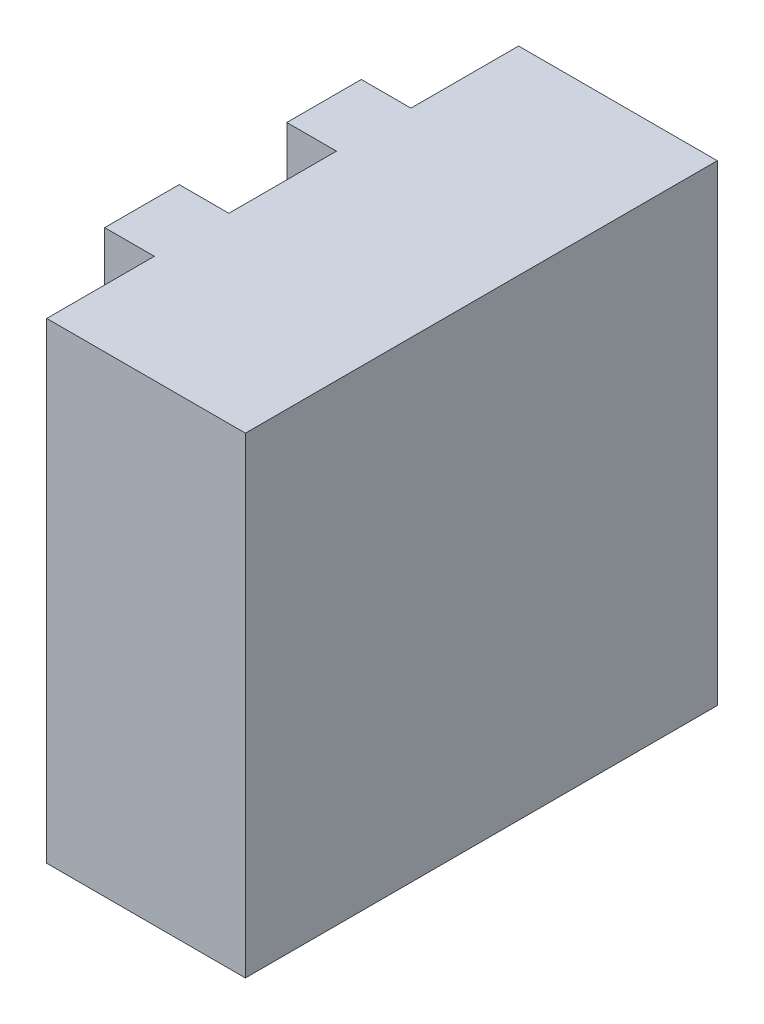
ISO-10303-21;
HEADER;
FILE_DESCRIPTION(('STEP AP214'),'2;1');
FILE_NAME('part.step','',(''),(''),'','','');
FILE_SCHEMA(('AUTOMOTIVE_DESIGN { 1 0 10303 214 1 1 1 1 }'));
ENDSEC;
DATA;
#1=APPLICATION_CONTEXT('core data for automotive mechanical design processes');
#2=APPLICATION_PROTOCOL_DEFINITION('international standard','automotive_design',2000,#1);
#3=PRODUCT_CONTEXT('',#1,'mechanical');
#4=PRODUCT('Part','Part','',(#3));
#5=PRODUCT_RELATED_PRODUCT_CATEGORY('part','',(#4));
#6=PRODUCT_DEFINITION_FORMATION('','',#4);
#7=PRODUCT_DEFINITION_CONTEXT('part definition',#1,'design');
#8=PRODUCT_DEFINITION('design','',#6,#7);
#9=PRODUCT_DEFINITION_SHAPE('','',#8);
#10=(LENGTH_UNIT() NAMED_UNIT(*) SI_UNIT(.MILLI.,.METRE.));
#11=(NAMED_UNIT(*) PLANE_ANGLE_UNIT() SI_UNIT($,.RADIAN.));
#12=(NAMED_UNIT(*) SI_UNIT($,.STERADIAN.) SOLID_ANGLE_UNIT());
#13=UNCERTAINTY_MEASURE_WITH_UNIT(LENGTH_MEASURE(1.E-05),#10,'distance_accuracy_value','');
#14=(GEOMETRIC_REPRESENTATION_CONTEXT(3) GLOBAL_UNCERTAINTY_ASSIGNED_CONTEXT((#13)) GLOBAL_UNIT_ASSIGNED_CONTEXT((#10,
#11,#12)) REPRESENTATION_CONTEXT('',''));
#15=CARTESIAN_POINT('',(0.,0.,0.));
#16=DIRECTION('',(0.,0.,1.));
#17=DIRECTION('',(1.,0.,0.));
#18=AXIS2_PLACEMENT_3D('',#15,#16,#17);
#19=CARTESIAN_POINT('',(0.,0.,0.));
#20=DIRECTION('',(-1.,0.,0.));
#21=DIRECTION('',(0.,0.,1.));
#22=AXIS2_PLACEMENT_3D('',#19,#20,#21);
#23=PLANE('',#22);
#24=DIRECTION('',(0.,0.,1.));
#25=VECTOR('',#24,1.);
#26=CARTESIAN_POINT('',(0.,1.5,-3.66666666666667));
#27=LINE('',#26,#25);
#28=CARTESIAN_POINT('',(0.,1.5,-3.66666666666667));
#29=VERTEX_POINT('',#28);
#30=CARTESIAN_POINT('',(0.,1.5,-2.16666666666667));
#31=VERTEX_POINT('',#30);
#32=EDGE_CURVE('E369',#29,#31,#27,.T.);
#33=ORIENTED_EDGE('',*,*,#32,.F.);
#34=DIRECTION('',(0.,-1.,0.));
#35=VECTOR('',#34,1.);
#36=CARTESIAN_POINT('',(0.,9.5,-3.66666666666667));
#37=LINE('',#36,#35);
#38=CARTESIAN_POINT('',(0.,9.5,-3.66666666666667));
#39=VERTEX_POINT('',#38);
#40=EDGE_CURVE('E366',#39,#29,#37,.T.);
#41=ORIENTED_EDGE('',*,*,#40,.F.);
#42=DIRECTION('',(0.,0.,-1.));
#43=VECTOR('',#42,1.);
#44=CARTESIAN_POINT('',(0.,9.5,0.));
#45=LINE('',#44,#43);
#46=CARTESIAN_POINT('',(0.,9.5,-5.83333333333333));
#47=VERTEX_POINT('',#46);
#48=EDGE_CURVE('E431',#39,#47,#45,.T.);
#49=ORIENTED_EDGE('',*,*,#48,.T.);
#50=DIRECTION('',(0.,-1.,0.));
#51=VECTOR('',#50,1.);
#52=CARTESIAN_POINT('',(0.,9.5,-5.83333333333333));
#53=LINE('',#52,#51);
#54=CARTESIAN_POINT('',(0.,1.5,-5.83333333333333));
#55=VERTEX_POINT('',#54);
#56=EDGE_CURVE('E375',#47,#55,#53,.T.);
#57=ORIENTED_EDGE('',*,*,#56,.T.);
#58=DIRECTION('',(0.,0.,1.));
#59=VECTOR('',#58,1.);
#60=CARTESIAN_POINT('',(0.,1.5,-7.33333333333333));
#61=LINE('',#60,#59);
#62=CARTESIAN_POINT('',(0.,1.5,-7.33333333333333));
#63=VERTEX_POINT('',#62);
#64=EDGE_CURVE('E397',#63,#55,#61,.T.);
#65=ORIENTED_EDGE('',*,*,#64,.F.);
#66=DIRECTION('',(0.,-1.,0.));
#67=VECTOR('',#66,1.);
#68=CARTESIAN_POINT('',(0.,9.5,-7.33333333333333));
#69=LINE('',#68,#67);
#70=CARTESIAN_POINT('',(0.,9.5,-7.33333333333333));
#71=VERTEX_POINT('',#70);
#72=EDGE_CURVE('E388',#71,#63,#69,.T.);
#73=ORIENTED_EDGE('',*,*,#72,.F.);
#74=CARTESIAN_POINT('',(0.,9.5,-9.5));
#75=VERTEX_POINT('',#74);
#76=EDGE_CURVE('E427',#71,#75,#45,.T.);
#77=ORIENTED_EDGE('',*,*,#76,.T.);
#78=DIRECTION('',(0.,1.,0.));
#79=VECTOR('',#78,1.);
#80=CARTESIAN_POINT('',(0.,0.,-9.5));
#81=LINE('',#80,#79);
#82=CARTESIAN_POINT('',(0.,0.,-9.5));
#83=VERTEX_POINT('',#82);
#84=EDGE_CURVE('E430',#83,#75,#81,.T.);
#85=ORIENTED_EDGE('',*,*,#84,.F.);
#86=DIRECTION('',(0.,0.,-1.));
#87=VECTOR('',#86,1.);
#88=CARTESIAN_POINT('',(0.,0.,0.));
#89=LINE('',#88,#87);
#90=CARTESIAN_POINT('',(0.,0.,0.));
#91=VERTEX_POINT('',#90);
#92=EDGE_CURVE('E418',#91,#83,#89,.T.);
#93=ORIENTED_EDGE('',*,*,#92,.F.);
#94=DIRECTION('',(0.,1.,0.));
#95=VECTOR('',#94,1.);
#96=CARTESIAN_POINT('',(0.,0.,0.));
#97=LINE('',#96,#95);
#98=CARTESIAN_POINT('',(0.,9.5,0.));
#99=VERTEX_POINT('',#98);
#100=EDGE_CURVE('E405',#91,#99,#97,.T.);
#101=ORIENTED_EDGE('',*,*,#100,.T.);
#102=CARTESIAN_POINT('',(0.,9.5,-2.16666666666667));
#103=VERTEX_POINT('',#102);
#104=EDGE_CURVE('E428',#99,#103,#45,.T.);
#105=ORIENTED_EDGE('',*,*,#104,.T.);
#106=DIRECTION('',(0.,-1.,0.));
#107=VECTOR('',#106,1.);
#108=CARTESIAN_POINT('',(0.,9.5,-2.16666666666667));
#109=LINE('',#108,#107);
#110=EDGE_CURVE('E373',#103,#31,#109,.T.);
#111=ORIENTED_EDGE('',*,*,#110,.T.);
#112=EDGE_LOOP('',(#33,#41,#49,#57,#65,#73,#77,#85,#93,#101,#105,#111));
#113=FACE_BOUND('',#112,.T.);
#114=DIRECTION('',(0.,0.,1.));
#115=VECTOR('',#114,1.);
#116=CARTESIAN_POINT('',(0.,0.9,-7.08333333333333));
#117=LINE('',#116,#115);
#118=CARTESIAN_POINT('',(0.,0.9,-7.08333333333333));
#119=VERTEX_POINT('',#118);
#120=CARTESIAN_POINT('',(0.,0.9,-6.73333333333333));
#121=VERTEX_POINT('',#120);
#122=EDGE_CURVE('E333',#119,#121,#117,.T.);
#123=ORIENTED_EDGE('',*,*,#122,.T.);
#124=DIRECTION('',(0.,1.,0.));
#125=VECTOR('',#124,1.);
#126=CARTESIAN_POINT('',(0.,0.25,-6.73333333333333));
#127=LINE('',#126,#125);
#128=CARTESIAN_POINT('',(0.,1.25,-6.73333333333333));
#129=VERTEX_POINT('',#128);
#130=EDGE_CURVE('E300',#121,#129,#127,.T.);
#131=ORIENTED_EDGE('',*,*,#130,.T.);
#132=DIRECTION('',(0.,0.,1.));
#133=VECTOR('',#132,1.);
#134=CARTESIAN_POINT('',(0.,1.25,-6.73333333333333));
#135=LINE('',#134,#133);
#136=CARTESIAN_POINT('',(0.,1.25,-6.43333333333333));
#137=VERTEX_POINT('',#136);
#138=EDGE_CURVE('E302',#129,#137,#135,.T.);
#139=ORIENTED_EDGE('',*,*,#138,.T.);
#140=DIRECTION('',(0.,1.,0.));
#141=VECTOR('',#140,1.);
#142=CARTESIAN_POINT('',(0.,0.25,-6.43333333333333));
#143=LINE('',#142,#141);
#144=CARTESIAN_POINT('',(0.,0.9,-6.43333333333333));
#145=VERTEX_POINT('',#144);
#146=EDGE_CURVE('E308',#145,#137,#143,.T.);
#147=ORIENTED_EDGE('',*,*,#146,.F.);
#148=CARTESIAN_POINT('',(0.,0.9,-6.08333333333333));
#149=VERTEX_POINT('',#148);
#150=EDGE_CURVE('E336',#145,#149,#117,.T.);
#151=ORIENTED_EDGE('',*,*,#150,.T.);
#152=DIRECTION('',(0.,-1.,0.));
#153=VECTOR('',#152,1.);
#154=CARTESIAN_POINT('',(0.,0.9,-6.08333333333333));
#155=LINE('',#154,#153);
#156=CARTESIAN_POINT('',(0.,0.6,-6.08333333333333));
#157=VERTEX_POINT('',#156);
#158=EDGE_CURVE('E338',#149,#157,#155,.T.);
#159=ORIENTED_EDGE('',*,*,#158,.T.);
#160=DIRECTION('',(0.,0.,1.));
#161=VECTOR('',#160,1.);
#162=CARTESIAN_POINT('',(0.,0.6,-7.08333333333333));
#163=LINE('',#162,#161);
#164=CARTESIAN_POINT('',(0.,0.6,-6.43333333333333));
#165=VERTEX_POINT('',#164);
#166=EDGE_CURVE('E342',#165,#157,#163,.T.);
#167=ORIENTED_EDGE('',*,*,#166,.F.);
#168=CARTESIAN_POINT('',(0.,0.25,-6.43333333333333));
#169=VERTEX_POINT('',#168);
#170=EDGE_CURVE('E305',#169,#165,#143,.T.);
#171=ORIENTED_EDGE('',*,*,#170,.F.);
#172=DIRECTION('',(0.,0.,1.));
#173=VECTOR('',#172,1.);
#174=CARTESIAN_POINT('',(0.,0.25,-6.73333333333333));
#175=LINE('',#174,#173);
#176=CARTESIAN_POINT('',(0.,0.25,-6.73333333333333));
#177=VERTEX_POINT('',#176);
#178=EDGE_CURVE('E309',#177,#169,#175,.T.);
#179=ORIENTED_EDGE('',*,*,#178,.F.);
#180=CARTESIAN_POINT('',(0.,0.6,-6.73333333333333));
#181=VERTEX_POINT('',#180);
#182=EDGE_CURVE('E297',#177,#181,#127,.T.);
#183=ORIENTED_EDGE('',*,*,#182,.T.);
#184=CARTESIAN_POINT('',(0.,0.6,-7.08333333333333));
#185=VERTEX_POINT('',#184);
#186=EDGE_CURVE('E85',#185,#181,#163,.T.);
#187=ORIENTED_EDGE('',*,*,#186,.F.);
#188=DIRECTION('',(0.,-1.,0.));
#189=VECTOR('',#188,1.);
#190=CARTESIAN_POINT('',(0.,0.9,-7.08333333333333));
#191=LINE('',#190,#189);
#192=EDGE_CURVE('E296',#119,#185,#191,.T.);
#193=ORIENTED_EDGE('',*,*,#192,.F.);
#194=EDGE_LOOP('',(#123,#131,#139,#147,#151,#159,#167,#171,#179,#183,#187,#193));
#195=FACE_BOUND('',#194,.T.);
#196=DIRECTION('',(0.,0.,-1.));
#197=VECTOR('',#196,1.);
#198=CARTESIAN_POINT('',(0.,0.9,-2.41666666666667));
#199=LINE('',#198,#197);
#200=CARTESIAN_POINT('',(0.,0.9,-2.41666666666667));
#201=VERTEX_POINT('',#200);
#202=CARTESIAN_POINT('',(0.,0.9,-3.41666666666667));
#203=VERTEX_POINT('',#202);
#204=EDGE_CURVE('E262',#201,#203,#199,.T.);
#205=ORIENTED_EDGE('',*,*,#204,.F.);
#206=DIRECTION('',(0.,-1.,0.));
#207=VECTOR('',#206,1.);
#208=CARTESIAN_POINT('',(0.,0.9,-2.41666666666667));
#209=LINE('',#208,#207);
#210=CARTESIAN_POINT('',(0.,0.6,-2.41666666666667));
#211=VERTEX_POINT('',#210);
#212=EDGE_CURVE('E77',#201,#211,#209,.T.);
#213=ORIENTED_EDGE('',*,*,#212,.T.);
#214=DIRECTION('',(0.,0.,-1.));
#215=VECTOR('',#214,1.);
#216=CARTESIAN_POINT('',(0.,0.6,-2.41666666666667));
#217=LINE('',#216,#215);
#218=CARTESIAN_POINT('',(0.,0.6,-3.41666666666667));
#219=VERTEX_POINT('',#218);
#220=EDGE_CURVE('E266',#211,#219,#217,.T.);
#221=ORIENTED_EDGE('',*,*,#220,.T.);
#222=DIRECTION('',(0.,-1.,0.));
#223=VECTOR('',#222,1.);
#224=CARTESIAN_POINT('',(0.,0.9,-3.41666666666667));
#225=LINE('',#224,#223);
#226=EDGE_CURVE('E747',#203,#219,#225,.T.);
#227=ORIENTED_EDGE('',*,*,#226,.F.);
#228=EDGE_LOOP('',(#205,#213,#221,#227));
#229=FACE_BOUND('',#228,.T.);
#230=ADVANCED_FACE('F60',(#113,#195,#229),#23,.T.);
#231=CARTESIAN_POINT('',(4.,0.,0.));
#232=DIRECTION('',(0.,0.,1.));
#233=DIRECTION('',(1.,0.,0.));
#234=AXIS2_PLACEMENT_3D('',#231,#232,#233);
#235=PLANE('',#234);
#236=ORIENTED_EDGE('',*,*,#100,.F.);
#237=DIRECTION('',(-1.,0.,0.));
#238=VECTOR('',#237,1.);
#239=CARTESIAN_POINT('',(4.,0.,0.));
#240=LINE('',#239,#238);
#241=CARTESIAN_POINT('',(4.,0.,0.));
#242=VERTEX_POINT('',#241);
#243=EDGE_CURVE('E12',#242,#91,#240,.T.);
#244=ORIENTED_EDGE('',*,*,#243,.F.);
#245=DIRECTION('',(0.,1.,0.));
#246=VECTOR('',#245,1.);
#247=CARTESIAN_POINT('',(4.,0.,0.));
#248=LINE('',#247,#246);
#249=CARTESIAN_POINT('',(4.,9.5,0.));
#250=VERTEX_POINT('',#249);
#251=EDGE_CURVE('E414',#242,#250,#248,.T.);
#252=ORIENTED_EDGE('',*,*,#251,.T.);
#253=DIRECTION('',(-1.,0.,0.));
#254=VECTOR('',#253,1.);
#255=CARTESIAN_POINT('',(4.,9.5,0.));
#256=LINE('',#255,#254);
#257=EDGE_CURVE('E64',#250,#99,#256,.T.);
#258=ORIENTED_EDGE('',*,*,#257,.T.);
#259=EDGE_LOOP('',(#236,#244,#252,#258));
#260=FACE_BOUND('',#259,.T.);
#261=ADVANCED_FACE('F62',(#260),#235,.T.);
#262=CARTESIAN_POINT('',(4.,0.,0.));
#263=DIRECTION('',(0.,1.,0.));
#264=DIRECTION('',(0.,0.,1.));
#265=AXIS2_PLACEMENT_3D('',#262,#263,#264);
#266=PLANE('',#265);
#267=ORIENTED_EDGE('',*,*,#92,.T.);
#268=DIRECTION('',(-1.,0.,0.));
#269=VECTOR('',#268,1.);
#270=CARTESIAN_POINT('',(4.,0.,-9.5));
#271=LINE('',#270,#269);
#272=CARTESIAN_POINT('',(4.,0.,-9.5));
#273=VERTEX_POINT('',#272);
#274=EDGE_CURVE('E69',#273,#83,#271,.T.);
#275=ORIENTED_EDGE('',*,*,#274,.F.);
#276=DIRECTION('',(0.,0.,-1.));
#277=VECTOR('',#276,1.);
#278=CARTESIAN_POINT('',(4.,0.,0.));
#279=LINE('',#278,#277);
#280=EDGE_CURVE('E423',#242,#273,#279,.T.);
#281=ORIENTED_EDGE('',*,*,#280,.F.);
#282=ORIENTED_EDGE('',*,*,#243,.T.);
#283=EDGE_LOOP('',(#267,#275,#281,#282));
#284=FACE_BOUND('',#283,.T.);
#285=ADVANCED_FACE('F454',(#284),#266,.F.);
#286=CARTESIAN_POINT('',(4.,0.,-9.5));
#287=DIRECTION('',(0.,0.,1.));
#288=DIRECTION('',(1.,0.,0.));
#289=AXIS2_PLACEMENT_3D('',#286,#287,#288);
#290=PLANE('',#289);
#291=ORIENTED_EDGE('',*,*,#84,.T.);
#292=DIRECTION('',(-1.,0.,0.));
#293=VECTOR('',#292,1.);
#294=CARTESIAN_POINT('',(4.,9.5,-9.5));
#295=LINE('',#294,#293);
#296=CARTESIAN_POINT('',(4.,9.5,-9.5));
#297=VERTEX_POINT('',#296);
#298=EDGE_CURVE('E436',#297,#75,#295,.T.);
#299=ORIENTED_EDGE('',*,*,#298,.F.);
#300=DIRECTION('',(0.,1.,0.));
#301=VECTOR('',#300,1.);
#302=CARTESIAN_POINT('',(4.,0.,-9.5));
#303=LINE('',#302,#301);
#304=EDGE_CURVE('E421',#273,#297,#303,.T.);
#305=ORIENTED_EDGE('',*,*,#304,.F.);
#306=ORIENTED_EDGE('',*,*,#274,.T.);
#307=EDGE_LOOP('',(#291,#299,#305,#306));
#308=FACE_BOUND('',#307,.T.);
#309=ADVANCED_FACE('F458',(#308),#290,.F.);
#310=CARTESIAN_POINT('',(4.,9.5,0.));
#311=DIRECTION('',(0.,1.,0.));
#312=DIRECTION('',(0.,0.,1.));
#313=AXIS2_PLACEMENT_3D('',#310,#311,#312);
#314=PLANE('',#313);
#315=ORIENTED_EDGE('',*,*,#104,.F.);
#316=ORIENTED_EDGE('',*,*,#257,.F.);
#317=DIRECTION('',(0.,0.,-1.));
#318=VECTOR('',#317,1.);
#319=CARTESIAN_POINT('',(4.,9.5,0.));
#320=LINE('',#319,#318);
#321=EDGE_CURVE('E417',#250,#297,#320,.T.);
#322=ORIENTED_EDGE('',*,*,#321,.T.);
#323=ORIENTED_EDGE('',*,*,#298,.T.);
#324=ORIENTED_EDGE('',*,*,#76,.F.);
#325=DIRECTION('',(1.,0.,0.));
#326=VECTOR('',#325,1.);
#327=CARTESIAN_POINT('',(-1.,9.5,-7.33333333333333));
#328=LINE('',#327,#326);
#329=CARTESIAN_POINT('',(-1.,9.5,-7.33333333333333));
#330=VERTEX_POINT('',#329);
#331=EDGE_CURVE('E402',#330,#71,#328,.T.);
#332=ORIENTED_EDGE('',*,*,#331,.F.);
#333=DIRECTION('',(0.,0.,1.));
#334=VECTOR('',#333,1.);
#335=CARTESIAN_POINT('',(-1.,9.5,-7.33333333333333));
#336=LINE('',#335,#334);
#337=CARTESIAN_POINT('',(-1.,9.5,-5.83333333333333));
#338=VERTEX_POINT('',#337);
#339=EDGE_CURVE('E384',#330,#338,#336,.T.);
#340=ORIENTED_EDGE('',*,*,#339,.T.);
#341=DIRECTION('',(1.,0.,0.));
#342=VECTOR('',#341,1.);
#343=CARTESIAN_POINT('',(-1.,9.5,-5.83333333333333));
#344=LINE('',#343,#342);
#345=EDGE_CURVE('E395',#338,#47,#344,.T.);
#346=ORIENTED_EDGE('',*,*,#345,.T.);
#347=ORIENTED_EDGE('',*,*,#48,.F.);
#348=DIRECTION('',(1.,0.,0.));
#349=VECTOR('',#348,1.);
#350=CARTESIAN_POINT('',(-1.,9.5,-3.66666666666667));
#351=LINE('',#350,#349);
#352=CARTESIAN_POINT('',(-1.,9.5,-3.66666666666667));
#353=VERTEX_POINT('',#352);
#354=EDGE_CURVE('E267',#353,#39,#351,.T.);
#355=ORIENTED_EDGE('',*,*,#354,.F.);
#356=DIRECTION('',(0.,0.,1.));
#357=VECTOR('',#356,1.);
#358=CARTESIAN_POINT('',(-1.,9.5,-3.66666666666667));
#359=LINE('',#358,#357);
#360=CARTESIAN_POINT('',(-1.,9.5,-2.16666666666667));
#361=VERTEX_POINT('',#360);
#362=EDGE_CURVE('E370',#353,#361,#359,.T.);
#363=ORIENTED_EDGE('',*,*,#362,.T.);
#364=DIRECTION('',(1.,0.,0.));
#365=VECTOR('',#364,1.);
#366=CARTESIAN_POINT('',(-1.,9.5,-2.16666666666667));
#367=LINE('',#366,#365);
#368=EDGE_CURVE('E357',#361,#103,#367,.T.);
#369=ORIENTED_EDGE('',*,*,#368,.T.);
#370=EDGE_LOOP('',(#315,#316,#322,#323,#324,#332,#340,#346,#347,#355,#363,#369));
#371=FACE_BOUND('',#370,.T.);
#372=ADVANCED_FACE('F446',(#371),#314,.T.);
#373=CARTESIAN_POINT('',(4.,0.,0.));
#374=DIRECTION('',(-1.,0.,0.));
#375=DIRECTION('',(0.,0.,1.));
#376=AXIS2_PLACEMENT_3D('',#373,#374,#375);
#377=PLANE('',#376);
#378=ORIENTED_EDGE('',*,*,#251,.F.);
#379=ORIENTED_EDGE('',*,*,#280,.T.);
#380=ORIENTED_EDGE('',*,*,#304,.T.);
#381=ORIENTED_EDGE('',*,*,#321,.F.);
#382=EDGE_LOOP('',(#378,#379,#380,#381));
#383=FACE_BOUND('',#382,.T.);
#384=ADVANCED_FACE('F460',(#383),#377,.F.);
#385=CARTESIAN_POINT('',(-1.,9.5,-7.33333333333333));
#386=DIRECTION('',(0.,0.,1.));
#387=DIRECTION('',(1.,0.,0.));
#388=AXIS2_PLACEMENT_3D('',#385,#386,#387);
#389=PLANE('',#388);
#390=ORIENTED_EDGE('',*,*,#72,.T.);
#391=DIRECTION('',(1.,0.,0.));
#392=VECTOR('',#391,1.);
#393=CARTESIAN_POINT('',(-1.,1.5,-7.33333333333333));
#394=LINE('',#393,#392);
#395=CARTESIAN_POINT('',(-1.,1.5,-7.33333333333333));
#396=VERTEX_POINT('',#395);
#397=EDGE_CURVE('E406',#396,#63,#394,.T.);
#398=ORIENTED_EDGE('',*,*,#397,.F.);
#399=DIRECTION('',(0.,-1.,0.));
#400=VECTOR('',#399,1.);
#401=CARTESIAN_POINT('',(-1.,9.5,-7.33333333333333));
#402=LINE('',#401,#400);
#403=EDGE_CURVE('E393',#330,#396,#402,.T.);
#404=ORIENTED_EDGE('',*,*,#403,.F.);
#405=ORIENTED_EDGE('',*,*,#331,.T.);
#406=EDGE_LOOP('',(#390,#398,#404,#405));
#407=FACE_BOUND('',#406,.T.);
#408=ADVANCED_FACE('F462',(#407),#389,.F.);
#409=CARTESIAN_POINT('',(-1.,1.5,-7.33333333333333));
#410=DIRECTION('',(0.,1.,0.));
#411=DIRECTION('',(0.,0.,1.));
#412=AXIS2_PLACEMENT_3D('',#409,#410,#411);
#413=PLANE('',#412);
#414=ORIENTED_EDGE('',*,*,#64,.T.);
#415=DIRECTION('',(1.,0.,0.));
#416=VECTOR('',#415,1.);
#417=CARTESIAN_POINT('',(-1.,1.5,-5.83333333333333));
#418=LINE('',#417,#416);
#419=CARTESIAN_POINT('',(-1.,1.5,-5.83333333333333));
#420=VERTEX_POINT('',#419);
#421=EDGE_CURVE('E409',#420,#55,#418,.T.);
#422=ORIENTED_EDGE('',*,*,#421,.F.);
#423=DIRECTION('',(0.,0.,1.));
#424=VECTOR('',#423,1.);
#425=CARTESIAN_POINT('',(-1.,1.5,-7.33333333333333));
#426=LINE('',#425,#424);
#427=EDGE_CURVE('E391',#396,#420,#426,.T.);
#428=ORIENTED_EDGE('',*,*,#427,.F.);
#429=ORIENTED_EDGE('',*,*,#397,.T.);
#430=EDGE_LOOP('',(#414,#422,#428,#429));
#431=FACE_BOUND('',#430,.T.);
#432=ADVANCED_FACE('F468',(#431),#413,.F.);
#433=CARTESIAN_POINT('',(-1.,9.5,-5.83333333333333));
#434=DIRECTION('',(0.,0.,1.));
#435=DIRECTION('',(0.,-1.,0.));
#436=AXIS2_PLACEMENT_3D('',#433,#434,#435);
#437=PLANE('',#436);
#438=ORIENTED_EDGE('',*,*,#56,.F.);
#439=ORIENTED_EDGE('',*,*,#345,.F.);
#440=DIRECTION('',(0.,-1.,0.));
#441=VECTOR('',#440,1.);
#442=CARTESIAN_POINT('',(-1.,9.5,-5.83333333333333));
#443=LINE('',#442,#441);
#444=EDGE_CURVE('E387',#338,#420,#443,.T.);
#445=ORIENTED_EDGE('',*,*,#444,.T.);
#446=ORIENTED_EDGE('',*,*,#421,.T.);
#447=EDGE_LOOP('',(#438,#439,#445,#446));
#448=FACE_BOUND('',#447,.T.);
#449=ADVANCED_FACE('F507',(#448),#437,.T.);
#450=CARTESIAN_POINT('',(-1.,0.,0.));
#451=DIRECTION('',(1.,0.,0.));
#452=DIRECTION('',(0.,0.,-1.));
#453=AXIS2_PLACEMENT_3D('',#450,#451,#452);
#454=PLANE('',#453);
#455=ORIENTED_EDGE('',*,*,#339,.F.);
#456=ORIENTED_EDGE('',*,*,#403,.T.);
#457=ORIENTED_EDGE('',*,*,#427,.T.);
#458=ORIENTED_EDGE('',*,*,#444,.F.);
#459=EDGE_LOOP('',(#455,#456,#457,#458));
#460=FACE_BOUND('',#459,.T.);
#461=ADVANCED_FACE('F517',(#460),#454,.F.);
#462=CARTESIAN_POINT('',(-1.,9.5,-3.66666666666667));
#463=DIRECTION('',(0.,0.,1.));
#464=DIRECTION('',(0.,-1.,0.));
#465=AXIS2_PLACEMENT_3D('',#462,#463,#464);
#466=PLANE('',#465);
#467=ORIENTED_EDGE('',*,*,#40,.T.);
#468=DIRECTION('',(1.,0.,0.));
#469=VECTOR('',#468,1.);
#470=CARTESIAN_POINT('',(-1.,1.5,-3.66666666666667));
#471=LINE('',#470,#469);
#472=CARTESIAN_POINT('',(-1.,1.5,-3.66666666666667));
#473=VERTEX_POINT('',#472);
#474=EDGE_CURVE('E271',#473,#29,#471,.T.);
#475=ORIENTED_EDGE('',*,*,#474,.F.);
#476=DIRECTION('',(0.,-1.,0.));
#477=VECTOR('',#476,1.);
#478=CARTESIAN_POINT('',(-1.,9.5,-3.66666666666667));
#479=LINE('',#478,#477);
#480=EDGE_CURVE('E360',#353,#473,#479,.T.);
#481=ORIENTED_EDGE('',*,*,#480,.F.);
#482=ORIENTED_EDGE('',*,*,#354,.T.);
#483=EDGE_LOOP('',(#467,#475,#481,#482));
#484=FACE_BOUND('',#483,.T.);
#485=ADVANCED_FACE('F526',(#484),#466,.F.);
#486=CARTESIAN_POINT('',(-1.,1.5,-3.66666666666667));
#487=DIRECTION('',(0.,1.,0.));
#488=DIRECTION('',(0.,0.,1.));
#489=AXIS2_PLACEMENT_3D('',#486,#487,#488);
#490=PLANE('',#489);
#491=ORIENTED_EDGE('',*,*,#32,.T.);
#492=DIRECTION('',(1.,0.,0.));
#493=VECTOR('',#492,1.);
#494=CARTESIAN_POINT('',(-1.,1.5,-2.16666666666667));
#495=LINE('',#494,#493);
#496=CARTESIAN_POINT('',(-1.,1.5,-2.16666666666667));
#497=VERTEX_POINT('',#496);
#498=EDGE_CURVE('E361',#497,#31,#495,.T.);
#499=ORIENTED_EDGE('',*,*,#498,.F.);
#500=DIRECTION('',(0.,0.,1.));
#501=VECTOR('',#500,1.);
#502=CARTESIAN_POINT('',(-1.,1.5,-3.66666666666667));
#503=LINE('',#502,#501);
#504=EDGE_CURVE('E377',#473,#497,#503,.T.);
#505=ORIENTED_EDGE('',*,*,#504,.F.);
#506=ORIENTED_EDGE('',*,*,#474,.T.);
#507=EDGE_LOOP('',(#491,#499,#505,#506));
#508=FACE_BOUND('',#507,.T.);
#509=ADVANCED_FACE('F536',(#508),#490,.F.);
#510=CARTESIAN_POINT('',(-1.,9.5,-2.16666666666667));
#511=DIRECTION('',(0.,0.,1.));
#512=DIRECTION('',(0.,-1.,0.));
#513=AXIS2_PLACEMENT_3D('',#510,#511,#512);
#514=PLANE('',#513);
#515=ORIENTED_EDGE('',*,*,#110,.F.);
#516=ORIENTED_EDGE('',*,*,#368,.F.);
#517=DIRECTION('',(0.,-1.,0.));
#518=VECTOR('',#517,1.);
#519=CARTESIAN_POINT('',(-1.,9.5,-2.16666666666667));
#520=LINE('',#519,#518);
#521=EDGE_CURVE('E379',#361,#497,#520,.T.);
#522=ORIENTED_EDGE('',*,*,#521,.T.);
#523=ORIENTED_EDGE('',*,*,#498,.T.);
#524=EDGE_LOOP('',(#515,#516,#522,#523));
#525=FACE_BOUND('',#524,.T.);
#526=ADVANCED_FACE('F546',(#525),#514,.T.);
#527=CARTESIAN_POINT('',(-1.,0.,0.));
#528=DIRECTION('',(1.,0.,0.));
#529=DIRECTION('',(0.,0.,-1.));
#530=AXIS2_PLACEMENT_3D('',#527,#528,#529);
#531=PLANE('',#530);
#532=ORIENTED_EDGE('',*,*,#362,.F.);
#533=ORIENTED_EDGE('',*,*,#480,.T.);
#534=ORIENTED_EDGE('',*,*,#504,.T.);
#535=ORIENTED_EDGE('',*,*,#521,.F.);
#536=EDGE_LOOP('',(#532,#533,#534,#535));
#537=FACE_BOUND('',#536,.T.);
#538=ADVANCED_FACE('F556',(#537),#531,.F.);
#539=CARTESIAN_POINT('',(0.2,0.,0.));
#540=DIRECTION('',(-1.,0.,0.));
#541=DIRECTION('',(0.,0.,1.));
#542=AXIS2_PLACEMENT_3D('',#539,#540,#541);
#543=PLANE('',#542);
#544=DIRECTION('',(0.,1.,0.));
#545=VECTOR('',#544,1.);
#546=CARTESIAN_POINT('',(0.2,0.25,-6.43333333333333));
#547=LINE('',#546,#545);
#548=CARTESIAN_POINT('',(0.2,0.9,-6.43333333333333));
#549=VERTEX_POINT('',#548);
#550=CARTESIAN_POINT('',(0.2,1.25,-6.43333333333333));
#551=VERTEX_POINT('',#550);
#552=EDGE_CURVE('E321',#549,#551,#547,.T.);
#553=ORIENTED_EDGE('',*,*,#552,.T.);
#554=DIRECTION('',(0.,0.,1.));
#555=VECTOR('',#554,1.);
#556=CARTESIAN_POINT('',(0.2,1.25,-6.73333333333333));
#557=LINE('',#556,#555);
#558=CARTESIAN_POINT('',(0.2,1.25,-6.73333333333333));
#559=VERTEX_POINT('',#558);
#560=EDGE_CURVE('E315',#559,#551,#557,.T.);
#561=ORIENTED_EDGE('',*,*,#560,.F.);
#562=DIRECTION('',(0.,1.,0.));
#563=VECTOR('',#562,1.);
#564=CARTESIAN_POINT('',(0.2,0.25,-6.73333333333333));
#565=LINE('',#564,#563);
#566=CARTESIAN_POINT('',(0.2,0.9,-6.73333333333333));
#567=VERTEX_POINT('',#566);
#568=EDGE_CURVE('E314',#567,#559,#565,.T.);
#569=ORIENTED_EDGE('',*,*,#568,.F.);
#570=DIRECTION('',(0.,0.,1.));
#571=VECTOR('',#570,1.);
#572=CARTESIAN_POINT('',(0.2,0.9,-7.08333333333333));
#573=LINE('',#572,#571);
#574=CARTESIAN_POINT('',(0.2,0.9,-7.08333333333333));
#575=VERTEX_POINT('',#574);
#576=EDGE_CURVE('E326',#575,#567,#573,.T.);
#577=ORIENTED_EDGE('',*,*,#576,.F.);
#578=DIRECTION('',(0.,-1.,0.));
#579=VECTOR('',#578,1.);
#580=CARTESIAN_POINT('',(0.2,0.9,-7.08333333333333));
#581=LINE('',#580,#579);
#582=CARTESIAN_POINT('',(0.2,0.6,-7.08333333333333));
#583=VERTEX_POINT('',#582);
#584=EDGE_CURVE('E337',#575,#583,#581,.T.);
#585=ORIENTED_EDGE('',*,*,#584,.T.);
#586=DIRECTION('',(0.,0.,1.));
#587=VECTOR('',#586,1.);
#588=CARTESIAN_POINT('',(0.2,0.6,-7.08333333333333));
#589=LINE('',#588,#587);
#590=CARTESIAN_POINT('',(0.2,0.6,-6.73333333333333));
#591=VERTEX_POINT('',#590);
#592=EDGE_CURVE('E351',#583,#591,#589,.T.);
#593=ORIENTED_EDGE('',*,*,#592,.T.);
#594=CARTESIAN_POINT('',(0.2,0.25,-6.73333333333333));
#595=VERTEX_POINT('',#594);
#596=EDGE_CURVE('E288',#595,#591,#565,.T.);
#597=ORIENTED_EDGE('',*,*,#596,.F.);
#598=DIRECTION('',(0.,0.,1.));
#599=VECTOR('',#598,1.);
#600=CARTESIAN_POINT('',(0.2,0.25,-6.73333333333333));
#601=LINE('',#600,#599);
#602=CARTESIAN_POINT('',(0.2,0.25,-6.43333333333333));
#603=VERTEX_POINT('',#602);
#604=EDGE_CURVE('E301',#595,#603,#601,.T.);
#605=ORIENTED_EDGE('',*,*,#604,.T.);
#606=CARTESIAN_POINT('',(0.2,0.6,-6.43333333333333));
#607=VERTEX_POINT('',#606);
#608=EDGE_CURVE('E318',#603,#607,#547,.T.);
#609=ORIENTED_EDGE('',*,*,#608,.T.);
#610=CARTESIAN_POINT('',(0.2,0.6,-6.08333333333333));
#611=VERTEX_POINT('',#610);
#612=EDGE_CURVE('E354',#607,#611,#589,.T.);
#613=ORIENTED_EDGE('',*,*,#612,.T.);
#614=DIRECTION('',(0.,-1.,0.));
#615=VECTOR('',#614,1.);
#616=CARTESIAN_POINT('',(0.2,0.9,-6.08333333333333));
#617=LINE('',#616,#615);
#618=CARTESIAN_POINT('',(0.2,0.9,-6.08333333333333));
#619=VERTEX_POINT('',#618);
#620=EDGE_CURVE('E348',#619,#611,#617,.T.);
#621=ORIENTED_EDGE('',*,*,#620,.F.);
#622=EDGE_CURVE('E347',#549,#619,#573,.T.);
#623=ORIENTED_EDGE('',*,*,#622,.F.);
#624=EDGE_LOOP('',(#553,#561,#569,#577,#585,#593,#597,#605,#609,#613,#621,#623));
#625=FACE_BOUND('',#624,.T.);
#626=ADVANCED_FACE('F565',(#625),#543,.T.);
#627=CARTESIAN_POINT('',(0.2,0.9,-7.08333333333333));
#628=DIRECTION('',(0.,0.,-1.));
#629=DIRECTION('',(-1.,0.,0.));
#630=AXIS2_PLACEMENT_3D('',#627,#628,#629);
#631=PLANE('',#630);
#632=ORIENTED_EDGE('',*,*,#192,.T.);
#633=DIRECTION('',(-1.,0.,0.));
#634=VECTOR('',#633,1.);
#635=CARTESIAN_POINT('',(0.2,0.6,-7.08333333333333));
#636=LINE('',#635,#634);
#637=EDGE_CURVE('E324',#583,#185,#636,.T.);
#638=ORIENTED_EDGE('',*,*,#637,.F.);
#639=ORIENTED_EDGE('',*,*,#584,.F.);
#640=DIRECTION('',(-1.,0.,0.));
#641=VECTOR('',#640,1.);
#642=CARTESIAN_POINT('',(0.2,0.9,-7.08333333333333));
#643=LINE('',#642,#641);
#644=EDGE_CURVE('E285',#575,#119,#643,.T.);
#645=ORIENTED_EDGE('',*,*,#644,.T.);
#646=EDGE_LOOP('',(#632,#638,#639,#645));
#647=FACE_BOUND('',#646,.T.);
#648=ADVANCED_FACE('F568',(#647),#631,.F.);
#649=CARTESIAN_POINT('',(0.2,0.9,-7.08333333333333));
#650=DIRECTION('',(0.,-1.,0.));
#651=DIRECTION('',(0.,0.,-1.));
#652=AXIS2_PLACEMENT_3D('',#649,#650,#651);
#653=PLANE('',#652);
#654=DIRECTION('',(-1.,0.,0.));
#655=VECTOR('',#654,1.);
#656=CARTESIAN_POINT('',(0.2,0.9,-6.73333333333333));
#657=LINE('',#656,#655);
#658=EDGE_CURVE('E277',#567,#121,#657,.T.);
#659=ORIENTED_EDGE('',*,*,#658,.T.);
#660=ORIENTED_EDGE('',*,*,#122,.F.);
#661=ORIENTED_EDGE('',*,*,#644,.F.);
#662=ORIENTED_EDGE('',*,*,#576,.T.);
#663=EDGE_LOOP('',(#659,#660,#661,#662));
#664=FACE_BOUND('',#663,.T.);
#665=ADVANCED_FACE('F591',(#664),#653,.T.);
#666=CARTESIAN_POINT('',(0.2,0.6,-7.08333333333333));
#667=DIRECTION('',(0.,-1.,0.));
#668=DIRECTION('',(0.,0.,-1.));
#669=AXIS2_PLACEMENT_3D('',#666,#667,#668);
#670=PLANE('',#669);
#671=ORIENTED_EDGE('',*,*,#592,.F.);
#672=ORIENTED_EDGE('',*,*,#637,.T.);
#673=ORIENTED_EDGE('',*,*,#186,.T.);
#674=DIRECTION('',(-1.,0.,0.));
#675=VECTOR('',#674,1.);
#676=CARTESIAN_POINT('',(0.2,0.6,-6.73333333333333));
#677=LINE('',#676,#675);
#678=EDGE_CURVE('E280',#591,#181,#677,.T.);
#679=ORIENTED_EDGE('',*,*,#678,.F.);
#680=EDGE_LOOP('',(#671,#672,#673,#679));
#681=FACE_BOUND('',#680,.T.);
#682=ADVANCED_FACE('F601',(#681),#670,.F.);
#683=ORIENTED_EDGE('',*,*,#622,.T.);
#684=DIRECTION('',(-1.,0.,0.));
#685=VECTOR('',#684,1.);
#686=CARTESIAN_POINT('',(0.2,0.9,-6.08333333333333));
#687=LINE('',#686,#685);
#688=EDGE_CURVE('E330',#619,#149,#687,.T.);
#689=ORIENTED_EDGE('',*,*,#688,.T.);
#690=ORIENTED_EDGE('',*,*,#150,.F.);
#691=DIRECTION('',(-1.,0.,0.));
#692=VECTOR('',#691,1.);
#693=CARTESIAN_POINT('',(0.2,0.9,-6.43333333333333));
#694=LINE('',#693,#692);
#695=EDGE_CURVE('E279',#549,#145,#694,.T.);
#696=ORIENTED_EDGE('',*,*,#695,.F.);
#697=EDGE_LOOP('',(#683,#689,#690,#696));
#698=FACE_BOUND('',#697,.T.);
#699=ADVANCED_FACE('F604',(#698),#653,.T.);
#700=CARTESIAN_POINT('',(0.2,0.9,-6.08333333333333));
#701=DIRECTION('',(0.,0.,-1.));
#702=DIRECTION('',(0.,1.,0.));
#703=AXIS2_PLACEMENT_3D('',#700,#701,#702);
#704=PLANE('',#703);
#705=ORIENTED_EDGE('',*,*,#158,.F.);
#706=ORIENTED_EDGE('',*,*,#688,.F.);
#707=ORIENTED_EDGE('',*,*,#620,.T.);
#708=DIRECTION('',(-1.,0.,0.));
#709=VECTOR('',#708,1.);
#710=CARTESIAN_POINT('',(0.2,0.6,-6.08333333333333));
#711=LINE('',#710,#709);
#712=EDGE_CURVE('E327',#611,#157,#711,.T.);
#713=ORIENTED_EDGE('',*,*,#712,.T.);
#714=EDGE_LOOP('',(#705,#706,#707,#713));
#715=FACE_BOUND('',#714,.T.);
#716=ADVANCED_FACE('F621',(#715),#704,.T.);
#717=DIRECTION('',(-1.,0.,0.));
#718=VECTOR('',#717,1.);
#719=CARTESIAN_POINT('',(0.2,0.6,-6.43333333333333));
#720=LINE('',#719,#718);
#721=EDGE_CURVE('E282',#607,#165,#720,.T.);
#722=ORIENTED_EDGE('',*,*,#721,.T.);
#723=ORIENTED_EDGE('',*,*,#166,.T.);
#724=ORIENTED_EDGE('',*,*,#712,.F.);
#725=ORIENTED_EDGE('',*,*,#612,.F.);
#726=EDGE_LOOP('',(#722,#723,#724,#725));
#727=FACE_BOUND('',#726,.T.);
#728=ADVANCED_FACE('F613',(#727),#670,.F.);
#729=CARTESIAN_POINT('',(0.2,1.25,-6.73333333333333));
#730=DIRECTION('',(0.,-1.,0.));
#731=DIRECTION('',(0.,0.,-1.));
#732=AXIS2_PLACEMENT_3D('',#729,#730,#731);
#733=PLANE('',#732);
#734=ORIENTED_EDGE('',*,*,#138,.F.);
#735=DIRECTION('',(-1.,0.,0.));
#736=VECTOR('',#735,1.);
#737=CARTESIAN_POINT('',(0.2,1.25,-6.73333333333333));
#738=LINE('',#737,#736);
#739=EDGE_CURVE('E292',#559,#129,#738,.T.);
#740=ORIENTED_EDGE('',*,*,#739,.F.);
#741=ORIENTED_EDGE('',*,*,#560,.T.);
#742=DIRECTION('',(-1.,0.,0.));
#743=VECTOR('',#742,1.);
#744=CARTESIAN_POINT('',(0.2,1.25,-6.43333333333333));
#745=LINE('',#744,#743);
#746=EDGE_CURVE('E289',#551,#137,#745,.T.);
#747=ORIENTED_EDGE('',*,*,#746,.T.);
#748=EDGE_LOOP('',(#734,#740,#741,#747));
#749=FACE_BOUND('',#748,.T.);
#750=ADVANCED_FACE('F639',(#749),#733,.T.);
#751=CARTESIAN_POINT('',(0.2,0.25,-6.43333333333333));
#752=DIRECTION('',(0.,0.,1.));
#753=DIRECTION('',(1.,0.,0.));
#754=AXIS2_PLACEMENT_3D('',#751,#752,#753);
#755=PLANE('',#754);
#756=ORIENTED_EDGE('',*,*,#695,.T.);
#757=ORIENTED_EDGE('',*,*,#146,.T.);
#758=ORIENTED_EDGE('',*,*,#746,.F.);
#759=ORIENTED_EDGE('',*,*,#552,.F.);
#760=EDGE_LOOP('',(#756,#757,#758,#759));
#761=FACE_BOUND('',#760,.T.);
#762=ADVANCED_FACE('F648',(#761),#755,.F.);
#763=CARTESIAN_POINT('',(0.2,0.25,-6.73333333333333));
#764=DIRECTION('',(0.,0.,1.));
#765=DIRECTION('',(1.,0.,0.));
#766=AXIS2_PLACEMENT_3D('',#763,#764,#765);
#767=PLANE('',#766);
#768=ORIENTED_EDGE('',*,*,#568,.T.);
#769=ORIENTED_EDGE('',*,*,#739,.T.);
#770=ORIENTED_EDGE('',*,*,#130,.F.);
#771=ORIENTED_EDGE('',*,*,#658,.F.);
#772=EDGE_LOOP('',(#768,#769,#770,#771));
#773=FACE_BOUND('',#772,.T.);
#774=ADVANCED_FACE('F658',(#773),#767,.T.);
#775=ORIENTED_EDGE('',*,*,#608,.F.);
#776=DIRECTION('',(-1.,0.,0.));
#777=VECTOR('',#776,1.);
#778=CARTESIAN_POINT('',(0.2,0.25,-6.43333333333333));
#779=LINE('',#778,#777);
#780=EDGE_CURVE('E286',#603,#169,#779,.T.);
#781=ORIENTED_EDGE('',*,*,#780,.T.);
#782=ORIENTED_EDGE('',*,*,#170,.T.);
#783=ORIENTED_EDGE('',*,*,#721,.F.);
#784=EDGE_LOOP('',(#775,#781,#782,#783));
#785=FACE_BOUND('',#784,.T.);
#786=ADVANCED_FACE('F583',(#785),#755,.F.);
#787=CARTESIAN_POINT('',(0.2,0.25,-6.73333333333333));
#788=DIRECTION('',(0.,-1.,0.));
#789=DIRECTION('',(0.,0.,-1.));
#790=AXIS2_PLACEMENT_3D('',#787,#788,#789);
#791=PLANE('',#790);
#792=ORIENTED_EDGE('',*,*,#178,.T.);
#793=ORIENTED_EDGE('',*,*,#780,.F.);
#794=ORIENTED_EDGE('',*,*,#604,.F.);
#795=DIRECTION('',(-1.,0.,0.));
#796=VECTOR('',#795,1.);
#797=CARTESIAN_POINT('',(0.2,0.25,-6.73333333333333));
#798=LINE('',#797,#796);
#799=EDGE_CURVE('E294',#595,#177,#798,.T.);
#800=ORIENTED_EDGE('',*,*,#799,.T.);
#801=EDGE_LOOP('',(#792,#793,#794,#800));
#802=FACE_BOUND('',#801,.T.);
#803=ADVANCED_FACE('F671',(#802),#791,.F.);
#804=ORIENTED_EDGE('',*,*,#678,.T.);
#805=ORIENTED_EDGE('',*,*,#182,.F.);
#806=ORIENTED_EDGE('',*,*,#799,.F.);
#807=ORIENTED_EDGE('',*,*,#596,.T.);
#808=EDGE_LOOP('',(#804,#805,#806,#807));
#809=FACE_BOUND('',#808,.T.);
#810=ADVANCED_FACE('F670',(#809),#767,.T.);
#811=CARTESIAN_POINT('',(0.2,0.9,-2.41666666666667));
#812=DIRECTION('',(0.,0.,-1.));
#813=DIRECTION('',(-1.,0.,0.));
#814=AXIS2_PLACEMENT_3D('',#811,#812,#813);
#815=PLANE('',#814);
#816=ORIENTED_EDGE('',*,*,#212,.F.);
#817=DIRECTION('',(-1.,0.,0.));
#818=VECTOR('',#817,1.);
#819=CARTESIAN_POINT('',(0.2,0.9,-2.41666666666667));
#820=LINE('',#819,#818);
#821=CARTESIAN_POINT('',(0.2,0.9,-2.41666666666667));
#822=VERTEX_POINT('',#821);
#823=EDGE_CURVE('E261',#822,#201,#820,.T.);
#824=ORIENTED_EDGE('',*,*,#823,.F.);
#825=DIRECTION('',(0.,-1.,0.));
#826=VECTOR('',#825,1.);
#827=CARTESIAN_POINT('',(0.2,0.9,-2.41666666666667));
#828=LINE('',#827,#826);
#829=CARTESIAN_POINT('',(0.2,0.6,-2.41666666666667));
#830=VERTEX_POINT('',#829);
#831=EDGE_CURVE('E251',#822,#830,#828,.T.);
#832=ORIENTED_EDGE('',*,*,#831,.T.);
#833=DIRECTION('',(-1.,0.,0.));
#834=VECTOR('',#833,1.);
#835=CARTESIAN_POINT('',(0.2,0.6,-2.41666666666667));
#836=LINE('',#835,#834);
#837=EDGE_CURVE('E260',#830,#211,#836,.T.);
#838=ORIENTED_EDGE('',*,*,#837,.T.);
#839=EDGE_LOOP('',(#816,#824,#832,#838));
#840=FACE_BOUND('',#839,.T.);
#841=ADVANCED_FACE('F259',(#840),#815,.T.);
#842=CARTESIAN_POINT('',(0.2,0.6,-2.41666666666667));
#843=DIRECTION('',(0.,1.,0.));
#844=DIRECTION('',(0.,0.,1.));
#845=AXIS2_PLACEMENT_3D('',#842,#843,#844);
#846=PLANE('',#845);
#847=ORIENTED_EDGE('',*,*,#220,.F.);
#848=ORIENTED_EDGE('',*,*,#837,.F.);
#849=DIRECTION('',(0.,0.,-1.));
#850=VECTOR('',#849,1.);
#851=CARTESIAN_POINT('',(0.2,0.6,-2.41666666666667));
#852=LINE('',#851,#850);
#853=CARTESIAN_POINT('',(0.2,0.6,-3.41666666666667));
#854=VERTEX_POINT('',#853);
#855=EDGE_CURVE('E247',#830,#854,#852,.T.);
#856=ORIENTED_EDGE('',*,*,#855,.T.);
#857=DIRECTION('',(-1.,0.,0.));
#858=VECTOR('',#857,1.);
#859=CARTESIAN_POINT('',(0.2,0.6,-3.41666666666667));
#860=LINE('',#859,#858);
#861=EDGE_CURVE('E268',#854,#219,#860,.T.);
#862=ORIENTED_EDGE('',*,*,#861,.T.);
#863=EDGE_LOOP('',(#847,#848,#856,#862));
#864=FACE_BOUND('',#863,.T.);
#865=ADVANCED_FACE('F264',(#864),#846,.T.);
#866=CARTESIAN_POINT('',(0.2,0.9,-3.41666666666667));
#867=DIRECTION('',(0.,0.,-1.));
#868=DIRECTION('',(-1.,0.,0.));
#869=AXIS2_PLACEMENT_3D('',#866,#867,#868);
#870=PLANE('',#869);
#871=ORIENTED_EDGE('',*,*,#226,.T.);
#872=ORIENTED_EDGE('',*,*,#861,.F.);
#873=DIRECTION('',(0.,-1.,0.));
#874=VECTOR('',#873,1.);
#875=CARTESIAN_POINT('',(0.2,0.9,-3.41666666666667));
#876=LINE('',#875,#874);
#877=CARTESIAN_POINT('',(0.2,0.9,-3.41666666666667));
#878=VERTEX_POINT('',#877);
#879=EDGE_CURVE('E254',#878,#854,#876,.T.);
#880=ORIENTED_EDGE('',*,*,#879,.F.);
#881=DIRECTION('',(-1.,0.,0.));
#882=VECTOR('',#881,1.);
#883=CARTESIAN_POINT('',(0.2,0.9,-3.41666666666667));
#884=LINE('',#883,#882);
#885=EDGE_CURVE('E273',#878,#203,#884,.T.);
#886=ORIENTED_EDGE('',*,*,#885,.T.);
#887=EDGE_LOOP('',(#871,#872,#880,#886));
#888=FACE_BOUND('',#887,.T.);
#889=ADVANCED_FACE('F712',(#888),#870,.F.);
#890=CARTESIAN_POINT('',(0.2,0.9,-2.41666666666667));
#891=DIRECTION('',(0.,1.,0.));
#892=DIRECTION('',(0.,0.,1.));
#893=AXIS2_PLACEMENT_3D('',#890,#891,#892);
#894=PLANE('',#893);
#895=ORIENTED_EDGE('',*,*,#204,.T.);
#896=ORIENTED_EDGE('',*,*,#885,.F.);
#897=DIRECTION('',(0.,0.,-1.));
#898=VECTOR('',#897,1.);
#899=CARTESIAN_POINT('',(0.2,0.9,-2.41666666666667));
#900=LINE('',#899,#898);
#901=EDGE_CURVE('E754',#822,#878,#900,.T.);
#902=ORIENTED_EDGE('',*,*,#901,.F.);
#903=ORIENTED_EDGE('',*,*,#823,.T.);
#904=EDGE_LOOP('',(#895,#896,#902,#903));
#905=FACE_BOUND('',#904,.T.);
#906=ADVANCED_FACE('F721',(#905),#894,.F.);
#907=CARTESIAN_POINT('',(0.2,0.,0.));
#908=DIRECTION('',(1.,0.,0.));
#909=DIRECTION('',(0.,0.,-1.));
#910=AXIS2_PLACEMENT_3D('',#907,#908,#909);
#911=PLANE('',#910);
#912=ORIENTED_EDGE('',*,*,#831,.F.);
#913=ORIENTED_EDGE('',*,*,#901,.T.);
#914=ORIENTED_EDGE('',*,*,#879,.T.);
#915=ORIENTED_EDGE('',*,*,#855,.F.);
#916=EDGE_LOOP('',(#912,#913,#914,#915));
#917=FACE_BOUND('',#916,.T.);
#918=ADVANCED_FACE('F249',(#917),#911,.F.);
#919=CLOSED_SHELL('',(#230,#261,#285,#309,#372,#384,#408,#432,#449,#461,#485,#509,#526,#538,
#626,#648,#665,#682,#699,#716,#728,#750,#762,#774,#786,#803,#810,#841,#865,#889,#906,#918));
#920=MANIFOLD_SOLID_BREP('B2',#919);
#921=ADVANCED_BREP_SHAPE_REPRESENTATION('',(#18,#920),#14);
#922=SHAPE_DEFINITION_REPRESENTATION(#9,#921);
ENDSEC;
END-ISO-10303-21;
